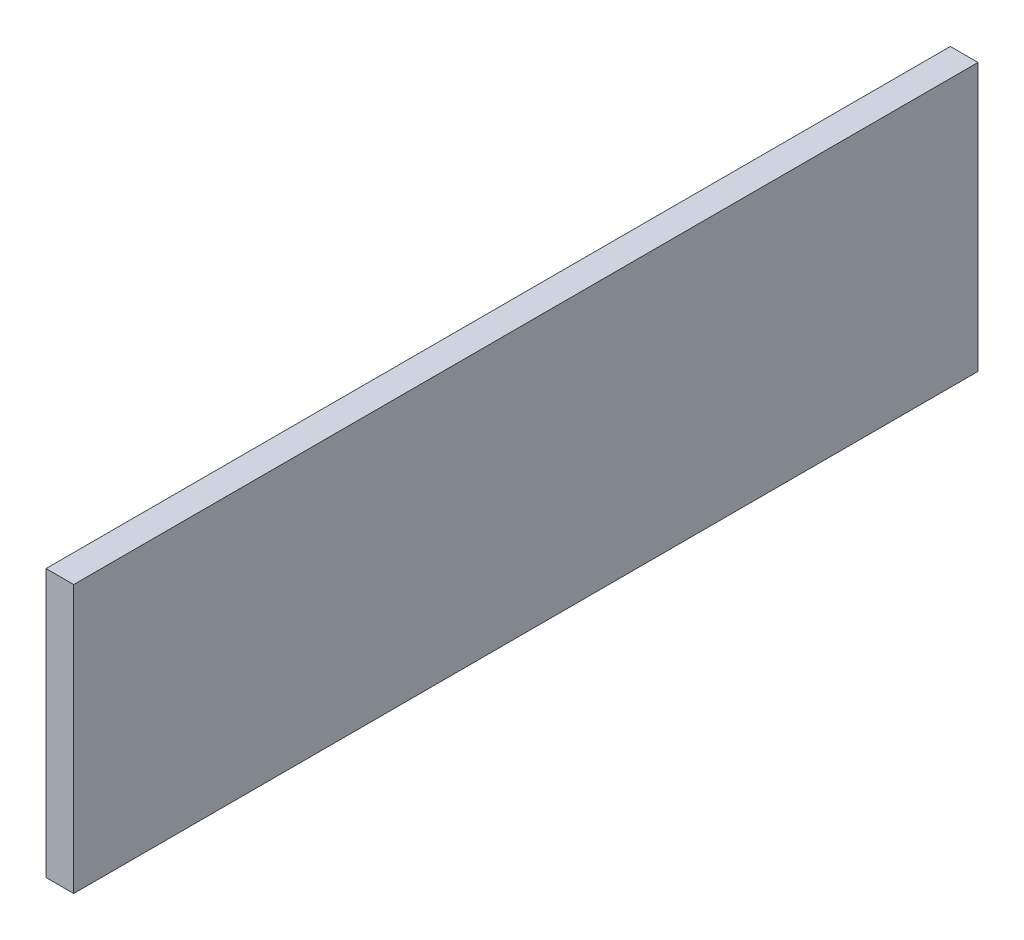
ISO-10303-21;
HEADER;
FILE_DESCRIPTION(('STEP AP214'),'2;1');
FILE_NAME('part.step','',(''),(''),'','','');
FILE_SCHEMA(('AUTOMOTIVE_DESIGN { 1 0 10303 214 1 1 1 1 }'));
ENDSEC;
DATA;
#1=APPLICATION_CONTEXT('core data for automotive mechanical design processes');
#2=APPLICATION_PROTOCOL_DEFINITION('international standard','automotive_design',2000,#1);
#3=PRODUCT_CONTEXT('',#1,'mechanical');
#4=PRODUCT('Part','Part','',(#3));
#5=PRODUCT_RELATED_PRODUCT_CATEGORY('part','',(#4));
#6=PRODUCT_DEFINITION_FORMATION('','',#4);
#7=PRODUCT_DEFINITION_CONTEXT('part definition',#1,'design');
#8=PRODUCT_DEFINITION('design','',#6,#7);
#9=PRODUCT_DEFINITION_SHAPE('','',#8);
#10=(LENGTH_UNIT() NAMED_UNIT(*) SI_UNIT(.MILLI.,.METRE.));
#11=(NAMED_UNIT(*) PLANE_ANGLE_UNIT() SI_UNIT($,.RADIAN.));
#12=(NAMED_UNIT(*) SI_UNIT($,.STERADIAN.) SOLID_ANGLE_UNIT());
#13=UNCERTAINTY_MEASURE_WITH_UNIT(LENGTH_MEASURE(1.E-05),#10,'distance_accuracy_value','');
#14=(GEOMETRIC_REPRESENTATION_CONTEXT(3) GLOBAL_UNCERTAINTY_ASSIGNED_CONTEXT((#13)) GLOBAL_UNIT_ASSIGNED_CONTEXT((#10,
#11,#12)) REPRESENTATION_CONTEXT('',''));
#15=CARTESIAN_POINT('',(0.,0.,0.));
#16=DIRECTION('',(0.,0.,1.));
#17=DIRECTION('',(1.,0.,0.));
#18=AXIS2_PLACEMENT_3D('',#15,#16,#17);
#19=CARTESIAN_POINT('',(19.05,0.,0.));
#20=DIRECTION('',(0.,0.,-1.));
#21=DIRECTION('',(-1.,0.,0.));
#22=AXIS2_PLACEMENT_3D('',#19,#20,#21);
#23=PLANE('',#22);
#24=DIRECTION('',(0.,-1.,0.));
#25=VECTOR('',#24,1.);
#26=CARTESIAN_POINT('',(0.,0.,0.));
#27=LINE('',#26,#25);
#28=CARTESIAN_POINT('',(0.,184.15,0.));
#29=VERTEX_POINT('',#28);
#30=CARTESIAN_POINT('',(0.,0.,0.));
#31=VERTEX_POINT('',#30);
#32=EDGE_CURVE('E107',#29,#31,#27,.T.);
#33=ORIENTED_EDGE('',*,*,#32,.T.);
#34=DIRECTION('',(-1.,0.,0.));
#35=VECTOR('',#34,1.);
#36=CARTESIAN_POINT('',(19.05,0.,0.));
#37=LINE('',#36,#35);
#38=CARTESIAN_POINT('',(19.05,0.,0.));
#39=VERTEX_POINT('',#38);
#40=EDGE_CURVE('E11',#39,#31,#37,.T.);
#41=ORIENTED_EDGE('',*,*,#40,.F.);
#42=DIRECTION('',(0.,-1.,0.));
#43=VECTOR('',#42,1.);
#44=CARTESIAN_POINT('',(19.05,0.,0.));
#45=LINE('',#44,#43);
#46=CARTESIAN_POINT('',(19.05,184.15,0.));
#47=VERTEX_POINT('',#46);
#48=EDGE_CURVE('E91',#47,#39,#45,.T.);
#49=ORIENTED_EDGE('',*,*,#48,.F.);
#50=DIRECTION('',(-1.,0.,0.));
#51=VECTOR('',#50,1.);
#52=CARTESIAN_POINT('',(19.05,184.15,0.));
#53=LINE('',#52,#51);
#54=EDGE_CURVE('E103',#47,#29,#53,.T.);
#55=ORIENTED_EDGE('',*,*,#54,.T.);
#56=EDGE_LOOP('',(#33,#41,#49,#55));
#57=FACE_BOUND('',#56,.T.);
#58=ADVANCED_FACE('F39',(#57),#23,.F.);
#59=CARTESIAN_POINT('',(19.05,0.,0.));
#60=DIRECTION('',(0.,1.,0.));
#61=DIRECTION('',(0.,0.,1.));
#62=AXIS2_PLACEMENT_3D('',#59,#60,#61);
#63=PLANE('',#62);
#64=DIRECTION('',(0.,0.,-1.));
#65=VECTOR('',#64,1.);
#66=CARTESIAN_POINT('',(0.,0.,0.));
#67=LINE('',#66,#65);
#68=CARTESIAN_POINT('',(0.,0.,-622.3));
#69=VERTEX_POINT('',#68);
#70=EDGE_CURVE('E96',#31,#69,#67,.T.);
#71=ORIENTED_EDGE('',*,*,#70,.T.);
#72=DIRECTION('',(-1.,0.,0.));
#73=VECTOR('',#72,1.);
#74=CARTESIAN_POINT('',(19.05,0.,-622.3));
#75=LINE('',#74,#73);
#76=CARTESIAN_POINT('',(19.05,0.,-622.3));
#77=VERTEX_POINT('',#76);
#78=EDGE_CURVE('E48',#77,#69,#75,.T.);
#79=ORIENTED_EDGE('',*,*,#78,.F.);
#80=DIRECTION('',(0.,0.,-1.));
#81=VECTOR('',#80,1.);
#82=CARTESIAN_POINT('',(19.05,0.,0.));
#83=LINE('',#82,#81);
#84=EDGE_CURVE('E86',#39,#77,#83,.T.);
#85=ORIENTED_EDGE('',*,*,#84,.F.);
#86=ORIENTED_EDGE('',*,*,#40,.T.);
#87=EDGE_LOOP('',(#71,#79,#85,#86));
#88=FACE_BOUND('',#87,.T.);
#89=ADVANCED_FACE('F95',(#88),#63,.F.);
#90=CARTESIAN_POINT('',(19.05,0.,-622.3));
#91=DIRECTION('',(0.,0.,1.));
#92=DIRECTION('',(1.,0.,0.));
#93=AXIS2_PLACEMENT_3D('',#90,#91,#92);
#94=PLANE('',#93);
#95=DIRECTION('',(0.,1.,0.));
#96=VECTOR('',#95,1.);
#97=CARTESIAN_POINT('',(0.,0.,-622.3));
#98=LINE('',#97,#96);
#99=CARTESIAN_POINT('',(0.,184.15,-622.3));
#100=VERTEX_POINT('',#99);
#101=EDGE_CURVE('E73',#69,#100,#98,.T.);
#102=ORIENTED_EDGE('',*,*,#101,.T.);
#103=DIRECTION('',(-1.,0.,0.));
#104=VECTOR('',#103,1.);
#105=CARTESIAN_POINT('',(19.05,184.15,-622.3));
#106=LINE('',#105,#104);
#107=CARTESIAN_POINT('',(19.05,184.15,-622.3));
#108=VERTEX_POINT('',#107);
#109=EDGE_CURVE('E98',#108,#100,#106,.T.);
#110=ORIENTED_EDGE('',*,*,#109,.F.);
#111=DIRECTION('',(0.,1.,0.));
#112=VECTOR('',#111,1.);
#113=CARTESIAN_POINT('',(19.05,0.,-622.3));
#114=LINE('',#113,#112);
#115=EDGE_CURVE('E89',#77,#108,#114,.T.);
#116=ORIENTED_EDGE('',*,*,#115,.F.);
#117=ORIENTED_EDGE('',*,*,#78,.T.);
#118=EDGE_LOOP('',(#102,#110,#116,#117));
#119=FACE_BOUND('',#118,.T.);
#120=ADVANCED_FACE('F99',(#119),#94,.F.);
#121=CARTESIAN_POINT('',(19.05,184.15,0.));
#122=DIRECTION('',(0.,-1.,0.));
#123=DIRECTION('',(0.,0.,-1.));
#124=AXIS2_PLACEMENT_3D('',#121,#122,#123);
#125=PLANE('',#124);
#126=DIRECTION('',(0.,0.,1.));
#127=VECTOR('',#126,1.);
#128=CARTESIAN_POINT('',(0.,184.15,0.));
#129=LINE('',#128,#127);
#130=EDGE_CURVE('E79',#100,#29,#129,.T.);
#131=ORIENTED_EDGE('',*,*,#130,.T.);
#132=ORIENTED_EDGE('',*,*,#54,.F.);
#133=DIRECTION('',(0.,0.,1.));
#134=VECTOR('',#133,1.);
#135=CARTESIAN_POINT('',(19.05,184.15,0.));
#136=LINE('',#135,#134);
#137=EDGE_CURVE('E56',#108,#47,#136,.T.);
#138=ORIENTED_EDGE('',*,*,#137,.F.);
#139=ORIENTED_EDGE('',*,*,#109,.T.);
#140=EDGE_LOOP('',(#131,#132,#138,#139));
#141=FACE_BOUND('',#140,.T.);
#142=ADVANCED_FACE('F120',(#141),#125,.F.);
#143=CARTESIAN_POINT('',(19.05,0.,0.));
#144=DIRECTION('',(-1.,0.,0.));
#145=DIRECTION('',(0.,0.,1.));
#146=AXIS2_PLACEMENT_3D('',#143,#144,#145);
#147=PLANE('',#146);
#148=ORIENTED_EDGE('',*,*,#48,.T.);
#149=ORIENTED_EDGE('',*,*,#84,.T.);
#150=ORIENTED_EDGE('',*,*,#115,.T.);
#151=ORIENTED_EDGE('',*,*,#137,.T.);
#152=EDGE_LOOP('',(#148,#149,#150,#151));
#153=FACE_BOUND('',#152,.T.);
#154=ADVANCED_FACE('F87',(#153),#147,.F.);
#155=CARTESIAN_POINT('',(0.,0.,0.));
#156=DIRECTION('',(-1.,0.,0.));
#157=DIRECTION('',(0.,0.,1.));
#158=AXIS2_PLACEMENT_3D('',#155,#156,#157);
#159=PLANE('',#158);
#160=ORIENTED_EDGE('',*,*,#32,.F.);
#161=ORIENTED_EDGE('',*,*,#130,.F.);
#162=ORIENTED_EDGE('',*,*,#101,.F.);
#163=ORIENTED_EDGE('',*,*,#70,.F.);
#164=EDGE_LOOP('',(#160,#161,#162,#163));
#165=FACE_BOUND('',#164,.T.);
#166=ADVANCED_FACE('F123',(#165),#159,.T.);
#167=CLOSED_SHELL('',(#58,#89,#120,#142,#154,#166));
#168=MANIFOLD_SOLID_BREP('B2',#167);
#169=ADVANCED_BREP_SHAPE_REPRESENTATION('',(#18,#168),#14);
#170=SHAPE_DEFINITION_REPRESENTATION(#9,#169);
ENDSEC;
END-ISO-10303-21;
